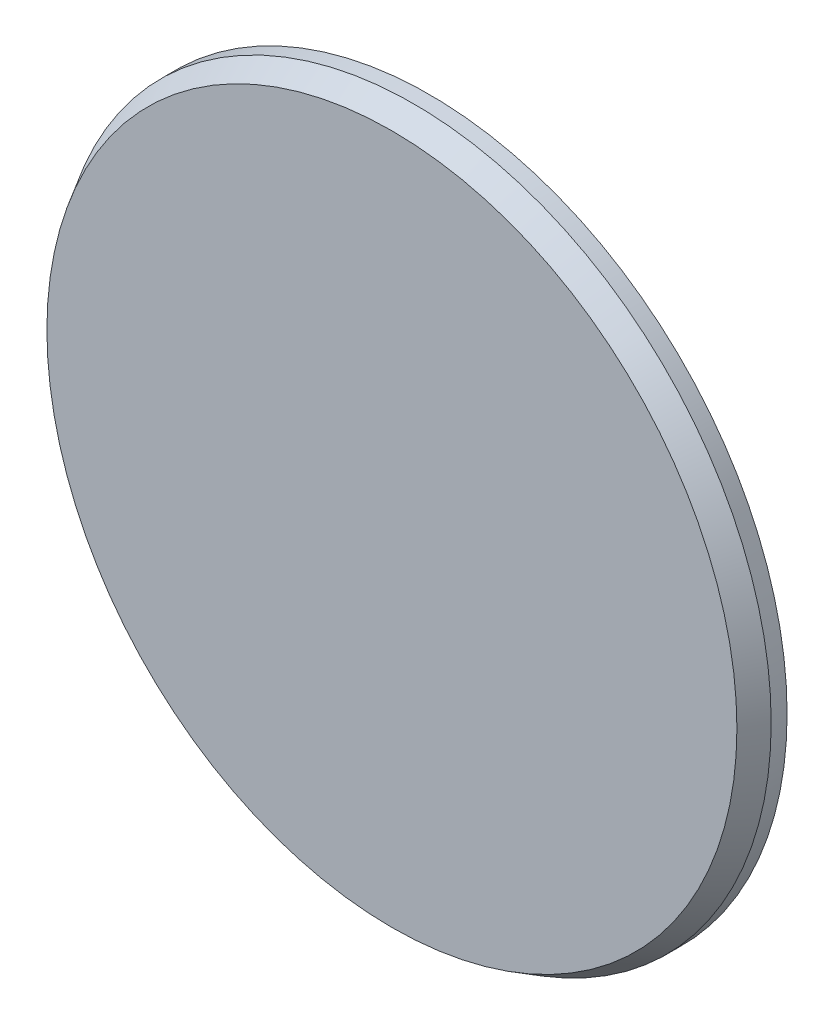
ISO-10303-21;
HEADER;
FILE_DESCRIPTION(('STEP AP214'),'2;1');
FILE_NAME('part.step','',(''),(''),'','','');
FILE_SCHEMA(('AUTOMOTIVE_DESIGN { 1 0 10303 214 1 1 1 1 }'));
ENDSEC;
DATA;
#1=APPLICATION_CONTEXT('core data for automotive mechanical design processes');
#2=APPLICATION_PROTOCOL_DEFINITION('international standard','automotive_design',2000,#1);
#3=PRODUCT_CONTEXT('',#1,'mechanical');
#4=PRODUCT('Part','Part','',(#3));
#5=PRODUCT_RELATED_PRODUCT_CATEGORY('part','',(#4));
#6=PRODUCT_DEFINITION_FORMATION('','',#4);
#7=PRODUCT_DEFINITION_CONTEXT('part definition',#1,'design');
#8=PRODUCT_DEFINITION('design','',#6,#7);
#9=PRODUCT_DEFINITION_SHAPE('','',#8);
#10=(LENGTH_UNIT() NAMED_UNIT(*) SI_UNIT(.MILLI.,.METRE.));
#11=(NAMED_UNIT(*) PLANE_ANGLE_UNIT() SI_UNIT($,.RADIAN.));
#12=(NAMED_UNIT(*) SI_UNIT($,.STERADIAN.) SOLID_ANGLE_UNIT());
#13=UNCERTAINTY_MEASURE_WITH_UNIT(LENGTH_MEASURE(1.E-05),#10,'distance_accuracy_value','');
#14=(GEOMETRIC_REPRESENTATION_CONTEXT(3) GLOBAL_UNCERTAINTY_ASSIGNED_CONTEXT((#13)) GLOBAL_UNIT_ASSIGNED_CONTEXT((#10,
#11,#12)) REPRESENTATION_CONTEXT('',''));
#15=CARTESIAN_POINT('',(0.,0.,0.));
#16=DIRECTION('',(0.,0.,1.));
#17=DIRECTION('',(1.,0.,0.));
#18=AXIS2_PLACEMENT_3D('',#15,#16,#17);
#19=CARTESIAN_POINT('',(0.,0.,3.));
#20=DIRECTION('',(0.,0.,-1.));
#21=DIRECTION('',(-1.,0.,0.));
#22=AXIS2_PLACEMENT_3D('',#19,#20,#21);
#23=CYLINDRICAL_SURFACE('',#22,28.5);
#24=CARTESIAN_POINT('',(0.,0.,1.26794919243111));
#25=DIRECTION('',(0.,0.,1.));
#26=DIRECTION('',(1.,0.,0.));
#27=AXIS2_PLACEMENT_3D('',#24,#25,#26);
#28=CIRCLE('',#27,28.5);
#29=CARTESIAN_POINT('',(28.5,0.,1.26794919243111));
#30=VERTEX_POINT('',#29);
#31=EDGE_CURVE('E10',#30,#30,#28,.F.);
#32=ORIENTED_EDGE('',*,*,#31,.T.);
#33=EDGE_LOOP('',(#32));
#34=FACE_BOUND('',#33,.T.);
#35=CARTESIAN_POINT('',(0.,0.,0.));
#36=DIRECTION('',(0.,0.,1.));
#37=DIRECTION('',(1.,0.,0.));
#38=AXIS2_PLACEMENT_3D('',#35,#36,#37);
#39=CIRCLE('',#38,28.5);
#40=CARTESIAN_POINT('',(28.5,0.,0.));
#41=VERTEX_POINT('',#40);
#42=EDGE_CURVE('E42',#41,#41,#39,.T.);
#43=ORIENTED_EDGE('',*,*,#42,.T.);
#44=EDGE_LOOP('',(#43));
#45=FACE_BOUND('',#44,.T.);
#46=ADVANCED_FACE('F31',(#34,#45),#23,.T.);
#47=CARTESIAN_POINT('',(0.,0.,3.));
#48=DIRECTION('',(0.,0.,1.));
#49=DIRECTION('',(1.,0.,0.));
#50=AXIS2_PLACEMENT_3D('',#47,#48,#49);
#51=PLANE('',#50);
#52=CARTESIAN_POINT('',(0.,0.,3.));
#53=DIRECTION('',(0.,0.,1.));
#54=DIRECTION('',(1.,0.,0.));
#55=AXIS2_PLACEMENT_3D('',#52,#53,#54);
#56=CIRCLE('',#55,27.5);
#57=CARTESIAN_POINT('',(27.5,0.,3.));
#58=VERTEX_POINT('',#57);
#59=EDGE_CURVE('E38',#58,#58,#56,.T.);
#60=ORIENTED_EDGE('',*,*,#59,.T.);
#61=EDGE_LOOP('',(#60));
#62=FACE_BOUND('',#61,.T.);
#63=ADVANCED_FACE('F52',(#62),#51,.T.);
#64=CARTESIAN_POINT('',(0.,0.,0.));
#65=DIRECTION('',(0.,0.,1.));
#66=DIRECTION('',(1.,0.,0.));
#67=AXIS2_PLACEMENT_3D('',#64,#65,#66);
#68=PLANE('',#67);
#69=ORIENTED_EDGE('',*,*,#42,.F.);
#70=EDGE_LOOP('',(#69));
#71=FACE_BOUND('',#70,.T.);
#72=ADVANCED_FACE('F50',(#71),#68,.F.);
#73=CARTESIAN_POINT('',(0.,0.,3.));
#74=DIRECTION('',(0.,0.,-1.));
#75=DIRECTION('',(-1.,0.,0.));
#76=AXIS2_PLACEMENT_3D('',#73,#74,#75);
#77=CONICAL_SURFACE('',#76,27.5,0.523598775598297);
#78=ORIENTED_EDGE('',*,*,#31,.F.);
#79=EDGE_LOOP('',(#78));
#80=FACE_BOUND('',#79,.T.);
#81=ORIENTED_EDGE('',*,*,#59,.F.);
#82=EDGE_LOOP('',(#81));
#83=FACE_BOUND('',#82,.T.);
#84=ADVANCED_FACE('F33',(#80,#83),#77,.T.);
#85=CLOSED_SHELL('',(#46,#63,#72,#84));
#86=MANIFOLD_SOLID_BREP('B2',#85);
#87=ADVANCED_BREP_SHAPE_REPRESENTATION('',(#18,#86),#14);
#88=SHAPE_DEFINITION_REPRESENTATION(#9,#87);
ENDSEC;
END-ISO-10303-21;
